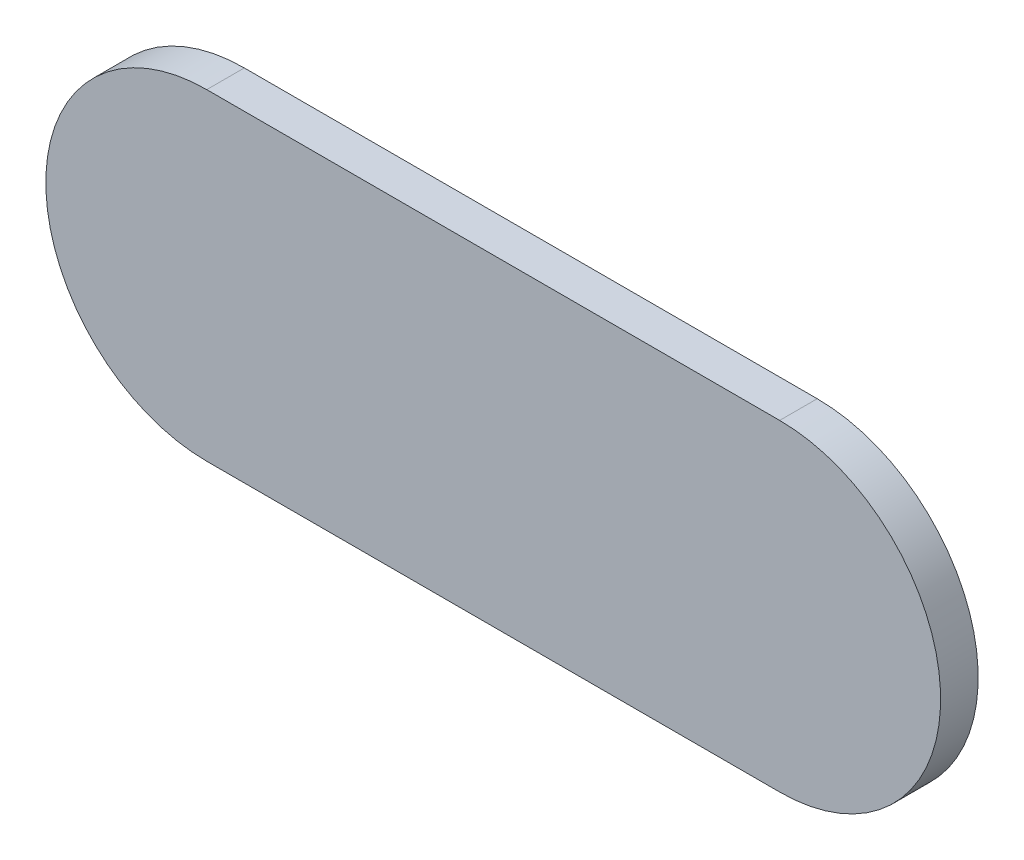
ISO-10303-21;
HEADER;
FILE_DESCRIPTION(('STEP AP214'),'2;1');
FILE_NAME('part.step','',(''),(''),'','','');
FILE_SCHEMA(('AUTOMOTIVE_DESIGN { 1 0 10303 214 1 1 1 1 }'));
ENDSEC;
DATA;
#1=APPLICATION_CONTEXT('core data for automotive mechanical design processes');
#2=APPLICATION_PROTOCOL_DEFINITION('international standard','automotive_design',2000,#1);
#3=PRODUCT_CONTEXT('',#1,'mechanical');
#4=PRODUCT('Part','Part','',(#3));
#5=PRODUCT_RELATED_PRODUCT_CATEGORY('part','',(#4));
#6=PRODUCT_DEFINITION_FORMATION('','',#4);
#7=PRODUCT_DEFINITION_CONTEXT('part definition',#1,'design');
#8=PRODUCT_DEFINITION('design','',#6,#7);
#9=PRODUCT_DEFINITION_SHAPE('','',#8);
#10=(LENGTH_UNIT() NAMED_UNIT(*) SI_UNIT(.MILLI.,.METRE.));
#11=(NAMED_UNIT(*) PLANE_ANGLE_UNIT() SI_UNIT($,.RADIAN.));
#12=(NAMED_UNIT(*) SI_UNIT($,.STERADIAN.) SOLID_ANGLE_UNIT());
#13=UNCERTAINTY_MEASURE_WITH_UNIT(LENGTH_MEASURE(1.E-05),#10,'distance_accuracy_value','');
#14=(GEOMETRIC_REPRESENTATION_CONTEXT(3) GLOBAL_UNCERTAINTY_ASSIGNED_CONTEXT((#13)) GLOBAL_UNIT_ASSIGNED_CONTEXT((#10,
#11,#12)) REPRESENTATION_CONTEXT('',''));
#15=CARTESIAN_POINT('',(0.,0.,0.));
#16=DIRECTION('',(0.,0.,1.));
#17=DIRECTION('',(1.,0.,0.));
#18=AXIS2_PLACEMENT_3D('',#15,#16,#17);
#19=CARTESIAN_POINT('',(129.018,-114.904,1.635));
#20=DIRECTION('',(0.,0.,1.));
#21=DIRECTION('',(1.,0.,0.));
#22=AXIS2_PLACEMENT_3D('',#19,#20,#21);
#23=PLANE('',#22);
#24=DIRECTION('',(-1.,0.,0.));
#25=VECTOR('',#24,1.);
#26=CARTESIAN_POINT('',(129.018,-114.904,1.635));
#27=LINE('',#26,#25);
#28=CARTESIAN_POINT('',(129.018,-114.904,1.635));
#29=VERTEX_POINT('',#28);
#30=CARTESIAN_POINT('',(128.484,-114.904,1.635));
#31=VERTEX_POINT('',#30);
#32=EDGE_CURVE('E94',#29,#31,#27,.T.);
#33=ORIENTED_EDGE('',*,*,#32,.T.);
#34=CARTESIAN_POINT('',(128.484,-115.054,1.635));
#35=DIRECTION('',(0.,0.,1.));
#36=DIRECTION('',(1.894780628694E-13,1.,0.));
#37=AXIS2_PLACEMENT_3D('',#34,#35,#36);
#38=CIRCLE('',#37,0.15);
#39=CARTESIAN_POINT('',(128.484,-115.204,1.635));
#40=VERTEX_POINT('',#39);
#41=EDGE_CURVE('E72',#31,#40,#38,.T.);
#42=ORIENTED_EDGE('',*,*,#41,.T.);
#43=DIRECTION('',(1.,0.,0.));
#44=VECTOR('',#43,1.);
#45=CARTESIAN_POINT('',(128.484,-115.204,1.635));
#46=LINE('',#45,#44);
#47=CARTESIAN_POINT('',(129.018,-115.204,1.635));
#48=VERTEX_POINT('',#47);
#49=EDGE_CURVE('E77',#40,#48,#46,.T.);
#50=ORIENTED_EDGE('',*,*,#49,.T.);
#51=CARTESIAN_POINT('',(129.018,-115.054,1.635));
#52=DIRECTION('',(0.,0.,1.));
#53=DIRECTION('',(-1.894780628694E-13,-1.,0.));
#54=AXIS2_PLACEMENT_3D('',#51,#52,#53);
#55=CIRCLE('',#54,0.15);
#56=EDGE_CURVE('E11',#48,#29,#55,.T.);
#57=ORIENTED_EDGE('',*,*,#56,.T.);
#58=EDGE_LOOP('',(#33,#42,#50,#57));
#59=FACE_BOUND('',#58,.T.);
#60=ADVANCED_FACE('F17',(#59),#23,.T.);
#61=CARTESIAN_POINT('',(129.018,-114.904,1.6));
#62=DIRECTION('',(0.,0.,1.));
#63=DIRECTION('',(1.,0.,0.));
#64=AXIS2_PLACEMENT_3D('',#61,#62,#63);
#65=PLANE('',#64);
#66=CARTESIAN_POINT('',(129.018,-115.054,1.6));
#67=DIRECTION('',(0.,0.,1.));
#68=DIRECTION('',(-1.894780628694E-13,-1.,0.));
#69=AXIS2_PLACEMENT_3D('',#66,#67,#68);
#70=CIRCLE('',#69,0.15);
#71=CARTESIAN_POINT('',(129.018,-115.204,1.6));
#72=VERTEX_POINT('',#71);
#73=CARTESIAN_POINT('',(129.018,-114.904,1.6));
#74=VERTEX_POINT('',#73);
#75=EDGE_CURVE('E20',#72,#74,#70,.T.);
#76=ORIENTED_EDGE('',*,*,#75,.F.);
#77=DIRECTION('',(1.,0.,0.));
#78=VECTOR('',#77,1.);
#79=CARTESIAN_POINT('',(128.484,-115.204,1.6));
#80=LINE('',#79,#78);
#81=CARTESIAN_POINT('',(128.484,-115.204,1.6));
#82=VERTEX_POINT('',#81);
#83=EDGE_CURVE('E61',#82,#72,#80,.T.);
#84=ORIENTED_EDGE('',*,*,#83,.F.);
#85=CARTESIAN_POINT('',(128.484,-115.054,1.6));
#86=DIRECTION('',(0.,0.,1.));
#87=DIRECTION('',(1.894780628694E-13,1.,0.));
#88=AXIS2_PLACEMENT_3D('',#85,#86,#87);
#89=CIRCLE('',#88,0.15);
#90=CARTESIAN_POINT('',(128.484,-114.904,1.6));
#91=VERTEX_POINT('',#90);
#92=EDGE_CURVE('E66',#91,#82,#89,.T.);
#93=ORIENTED_EDGE('',*,*,#92,.F.);
#94=DIRECTION('',(-1.,0.,0.));
#95=VECTOR('',#94,1.);
#96=CARTESIAN_POINT('',(129.018,-114.904,1.6));
#97=LINE('',#96,#95);
#98=EDGE_CURVE('E117',#74,#91,#97,.T.);
#99=ORIENTED_EDGE('',*,*,#98,.F.);
#100=EDGE_LOOP('',(#76,#84,#93,#99));
#101=FACE_BOUND('',#100,.T.);
#102=ADVANCED_FACE('F63',(#101),#65,.F.);
#103=CARTESIAN_POINT('',(129.018,-115.054,1.6));
#104=DIRECTION('',(0.,0.,-1.));
#105=DIRECTION('',(-1.894780628694E-13,-1.,0.));
#106=AXIS2_PLACEMENT_3D('',#103,#104,#105);
#107=CYLINDRICAL_SURFACE('',#106,0.15);
#108=ORIENTED_EDGE('',*,*,#75,.T.);
#109=DIRECTION('',(0.,0.,1.));
#110=VECTOR('',#109,1.);
#111=CARTESIAN_POINT('',(129.018,-114.904,1.6));
#112=LINE('',#111,#110);
#113=EDGE_CURVE('E88',#74,#29,#112,.T.);
#114=ORIENTED_EDGE('',*,*,#113,.T.);
#115=ORIENTED_EDGE('',*,*,#56,.F.);
#116=DIRECTION('',(0.,0.,1.));
#117=VECTOR('',#116,1.);
#118=CARTESIAN_POINT('',(129.018,-115.204,1.6));
#119=LINE('',#118,#117);
#120=EDGE_CURVE('E71',#72,#48,#119,.T.);
#121=ORIENTED_EDGE('',*,*,#120,.F.);
#122=EDGE_LOOP('',(#108,#114,#115,#121));
#123=FACE_BOUND('',#122,.T.);
#124=ADVANCED_FACE('F113',(#123),#107,.T.);
#125=CARTESIAN_POINT('',(128.484,-115.204,1.6));
#126=DIRECTION('',(0.,1.,0.));
#127=DIRECTION('',(1.,0.,0.));
#128=AXIS2_PLACEMENT_3D('',#125,#126,#127);
#129=PLANE('',#128);
#130=ORIENTED_EDGE('',*,*,#83,.T.);
#131=ORIENTED_EDGE('',*,*,#120,.T.);
#132=ORIENTED_EDGE('',*,*,#49,.F.);
#133=DIRECTION('',(0.,0.,1.));
#134=VECTOR('',#133,1.);
#135=CARTESIAN_POINT('',(128.484,-115.204,1.6));
#136=LINE('',#135,#134);
#137=EDGE_CURVE('E75',#82,#40,#136,.T.);
#138=ORIENTED_EDGE('',*,*,#137,.F.);
#139=EDGE_LOOP('',(#130,#131,#132,#138));
#140=FACE_BOUND('',#139,.T.);
#141=ADVANCED_FACE('F76',(#140),#129,.F.);
#142=CARTESIAN_POINT('',(128.484,-115.054,1.6));
#143=DIRECTION('',(0.,0.,-1.));
#144=DIRECTION('',(1.894780628694E-13,1.,0.));
#145=AXIS2_PLACEMENT_3D('',#142,#143,#144);
#146=CYLINDRICAL_SURFACE('',#145,0.15);
#147=ORIENTED_EDGE('',*,*,#92,.T.);
#148=ORIENTED_EDGE('',*,*,#137,.T.);
#149=ORIENTED_EDGE('',*,*,#41,.F.);
#150=DIRECTION('',(0.,0.,1.));
#151=VECTOR('',#150,1.);
#152=CARTESIAN_POINT('',(128.484,-114.904,1.6));
#153=LINE('',#152,#151);
#154=EDGE_CURVE('E85',#91,#31,#153,.T.);
#155=ORIENTED_EDGE('',*,*,#154,.F.);
#156=EDGE_LOOP('',(#147,#148,#149,#155));
#157=FACE_BOUND('',#156,.T.);
#158=ADVANCED_FACE('F83',(#157),#146,.T.);
#159=CARTESIAN_POINT('',(129.018,-114.904,1.6));
#160=DIRECTION('',(0.,-1.,0.));
#161=DIRECTION('',(0.,0.,-1.));
#162=AXIS2_PLACEMENT_3D('',#159,#160,#161);
#163=PLANE('',#162);
#164=ORIENTED_EDGE('',*,*,#98,.T.);
#165=ORIENTED_EDGE('',*,*,#154,.T.);
#166=ORIENTED_EDGE('',*,*,#32,.F.);
#167=ORIENTED_EDGE('',*,*,#113,.F.);
#168=EDGE_LOOP('',(#164,#165,#166,#167));
#169=FACE_BOUND('',#168,.T.);
#170=ADVANCED_FACE('F116',(#169),#163,.F.);
#171=CLOSED_SHELL('',(#60,#102,#124,#141,#158,#170));
#172=MANIFOLD_SOLID_BREP('B1',#171);
#173=ADVANCED_BREP_SHAPE_REPRESENTATION('',(#18,#172),#14);
#174=SHAPE_DEFINITION_REPRESENTATION(#9,#173);
ENDSEC;
END-ISO-10303-21;
